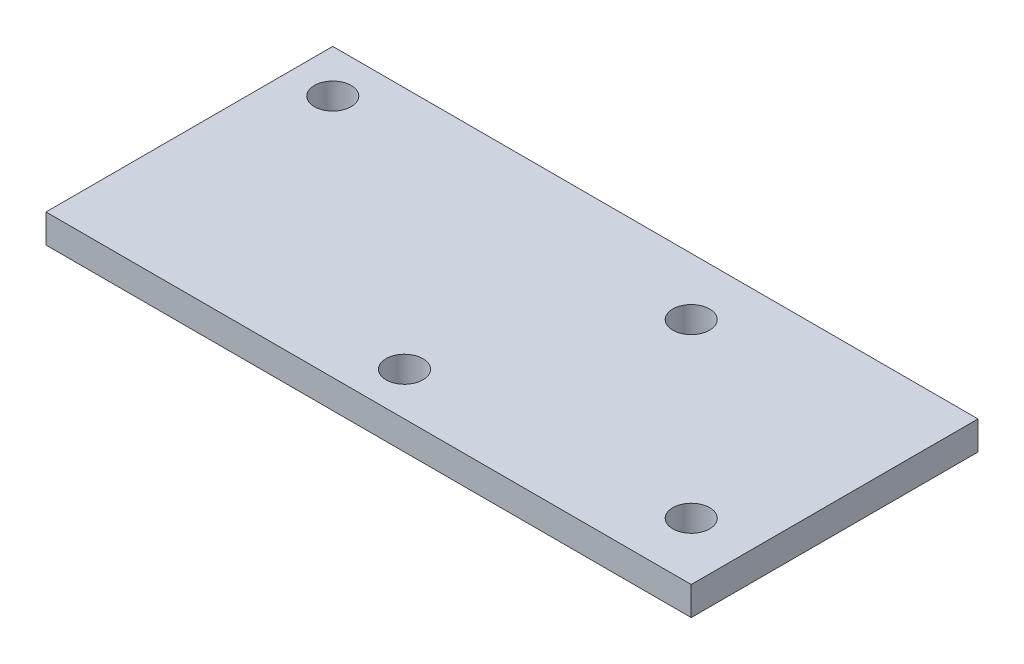
ISO-10303-21;
HEADER;
FILE_DESCRIPTION(('STEP AP214'),'2;1');
FILE_NAME('part.step','',(''),(''),'','','');
FILE_SCHEMA(('AUTOMOTIVE_DESIGN { 1 0 10303 214 1 1 1 1 }'));
ENDSEC;
DATA;
#1=APPLICATION_CONTEXT('core data for automotive mechanical design processes');
#2=APPLICATION_PROTOCOL_DEFINITION('international standard','automotive_design',2000,#1);
#3=PRODUCT_CONTEXT('',#1,'mechanical');
#4=PRODUCT('Part','Part','',(#3));
#5=PRODUCT_RELATED_PRODUCT_CATEGORY('part','',(#4));
#6=PRODUCT_DEFINITION_FORMATION('','',#4);
#7=PRODUCT_DEFINITION_CONTEXT('part definition',#1,'design');
#8=PRODUCT_DEFINITION('design','',#6,#7);
#9=PRODUCT_DEFINITION_SHAPE('','',#8);
#10=(LENGTH_UNIT() NAMED_UNIT(*) SI_UNIT(.MILLI.,.METRE.));
#11=(NAMED_UNIT(*) PLANE_ANGLE_UNIT() SI_UNIT($,.RADIAN.));
#12=(NAMED_UNIT(*) SI_UNIT($,.STERADIAN.) SOLID_ANGLE_UNIT());
#13=UNCERTAINTY_MEASURE_WITH_UNIT(LENGTH_MEASURE(1.E-05),#10,'distance_accuracy_value','');
#14=(GEOMETRIC_REPRESENTATION_CONTEXT(3) GLOBAL_UNCERTAINTY_ASSIGNED_CONTEXT((#13)) GLOBAL_UNIT_ASSIGNED_CONTEXT((#10,
#11,#12)) REPRESENTATION_CONTEXT('',''));
#15=CARTESIAN_POINT('',(0.,0.,0.));
#16=DIRECTION('',(0.,0.,1.));
#17=DIRECTION('',(1.,0.,0.));
#18=AXIS2_PLACEMENT_3D('',#15,#16,#17);
#19=CARTESIAN_POINT('',(28.575,2.54,-12.7));
#20=DIRECTION('',(-1.,0.,0.));
#21=DIRECTION('',(0.,0.,1.));
#22=AXIS2_PLACEMENT_3D('',#19,#20,#21);
#23=PLANE('',#22);
#24=DIRECTION('',(0.,0.,-1.));
#25=VECTOR('',#24,1.);
#26=CARTESIAN_POINT('',(28.575,0.,-12.7));
#27=LINE('',#26,#25);
#28=CARTESIAN_POINT('',(28.575,0.,12.7));
#29=VERTEX_POINT('',#28);
#30=CARTESIAN_POINT('',(28.575,0.,-12.7));
#31=VERTEX_POINT('',#30);
#32=EDGE_CURVE('E95',#29,#31,#27,.T.);
#33=ORIENTED_EDGE('',*,*,#32,.T.);
#34=DIRECTION('',(0.,-1.,0.));
#35=VECTOR('',#34,1.);
#36=CARTESIAN_POINT('',(28.575,2.54,-12.7));
#37=LINE('',#36,#35);
#38=CARTESIAN_POINT('',(28.575,2.54,-12.7));
#39=VERTEX_POINT('',#38);
#40=EDGE_CURVE('E11',#39,#31,#37,.T.);
#41=ORIENTED_EDGE('',*,*,#40,.F.);
#42=DIRECTION('',(0.,0.,-1.));
#43=VECTOR('',#42,1.);
#44=CARTESIAN_POINT('',(28.575,2.54,-12.7));
#45=LINE('',#44,#43);
#46=CARTESIAN_POINT('',(28.575,2.54,12.7));
#47=VERTEX_POINT('',#46);
#48=EDGE_CURVE('E83',#47,#39,#45,.T.);
#49=ORIENTED_EDGE('',*,*,#48,.F.);
#50=DIRECTION('',(0.,-1.,0.));
#51=VECTOR('',#50,1.);
#52=CARTESIAN_POINT('',(28.575,2.54,12.7));
#53=LINE('',#52,#51);
#54=EDGE_CURVE('E91',#47,#29,#53,.T.);
#55=ORIENTED_EDGE('',*,*,#54,.T.);
#56=EDGE_LOOP('',(#33,#41,#49,#55));
#57=FACE_BOUND('',#56,.T.);
#58=ADVANCED_FACE('F32',(#57),#23,.F.);
#59=CARTESIAN_POINT('',(-28.575,2.54,-12.7));
#60=DIRECTION('',(0.,0.,1.));
#61=DIRECTION('',(1.,0.,0.));
#62=AXIS2_PLACEMENT_3D('',#59,#60,#61);
#63=PLANE('',#62);
#64=DIRECTION('',(-1.,0.,0.));
#65=VECTOR('',#64,1.);
#66=CARTESIAN_POINT('',(-28.575,0.,-12.7));
#67=LINE('',#66,#65);
#68=CARTESIAN_POINT('',(-28.575,0.,-12.7));
#69=VERTEX_POINT('',#68);
#70=EDGE_CURVE('E87',#31,#69,#67,.T.);
#71=ORIENTED_EDGE('',*,*,#70,.T.);
#72=DIRECTION('',(0.,-1.,0.));
#73=VECTOR('',#72,1.);
#74=CARTESIAN_POINT('',(-28.575,2.54,-12.7));
#75=LINE('',#74,#73);
#76=CARTESIAN_POINT('',(-28.575,2.54,-12.7));
#77=VERTEX_POINT('',#76);
#78=EDGE_CURVE('E40',#77,#69,#75,.T.);
#79=ORIENTED_EDGE('',*,*,#78,.F.);
#80=DIRECTION('',(-1.,0.,0.));
#81=VECTOR('',#80,1.);
#82=CARTESIAN_POINT('',(-28.575,2.54,-12.7));
#83=LINE('',#82,#81);
#84=EDGE_CURVE('E78',#39,#77,#83,.T.);
#85=ORIENTED_EDGE('',*,*,#84,.F.);
#86=ORIENTED_EDGE('',*,*,#40,.T.);
#87=EDGE_LOOP('',(#71,#79,#85,#86));
#88=FACE_BOUND('',#87,.T.);
#89=ADVANCED_FACE('F86',(#88),#63,.F.);
#90=CARTESIAN_POINT('',(-28.575,2.54,-12.7));
#91=DIRECTION('',(1.,0.,0.));
#92=DIRECTION('',(0.,0.,-1.));
#93=AXIS2_PLACEMENT_3D('',#90,#91,#92);
#94=PLANE('',#93);
#95=DIRECTION('',(0.,0.,1.));
#96=VECTOR('',#95,1.);
#97=CARTESIAN_POINT('',(-28.575,0.,-12.7));
#98=LINE('',#97,#96);
#99=CARTESIAN_POINT('',(-28.575,0.,12.7));
#100=VERTEX_POINT('',#99);
#101=EDGE_CURVE('E65',#69,#100,#98,.T.);
#102=ORIENTED_EDGE('',*,*,#101,.T.);
#103=DIRECTION('',(0.,-1.,0.));
#104=VECTOR('',#103,1.);
#105=CARTESIAN_POINT('',(-28.575,2.54,12.7));
#106=LINE('',#105,#104);
#107=CARTESIAN_POINT('',(-28.575,2.54,12.7));
#108=VERTEX_POINT('',#107);
#109=EDGE_CURVE('E88',#108,#100,#106,.T.);
#110=ORIENTED_EDGE('',*,*,#109,.F.);
#111=DIRECTION('',(0.,0.,1.));
#112=VECTOR('',#111,1.);
#113=CARTESIAN_POINT('',(-28.575,2.54,-12.7));
#114=LINE('',#113,#112);
#115=EDGE_CURVE('E81',#77,#108,#114,.T.);
#116=ORIENTED_EDGE('',*,*,#115,.F.);
#117=ORIENTED_EDGE('',*,*,#78,.T.);
#118=EDGE_LOOP('',(#102,#110,#116,#117));
#119=FACE_BOUND('',#118,.T.);
#120=ADVANCED_FACE('F89',(#119),#94,.F.);
#121=CARTESIAN_POINT('',(-28.575,2.54,12.7));
#122=DIRECTION('',(0.,0.,-1.));
#123=DIRECTION('',(-1.,0.,0.));
#124=AXIS2_PLACEMENT_3D('',#121,#122,#123);
#125=PLANE('',#124);
#126=DIRECTION('',(1.,0.,0.));
#127=VECTOR('',#126,1.);
#128=CARTESIAN_POINT('',(-28.575,0.,12.7));
#129=LINE('',#128,#127);
#130=EDGE_CURVE('E71',#100,#29,#129,.T.);
#131=ORIENTED_EDGE('',*,*,#130,.T.);
#132=ORIENTED_EDGE('',*,*,#54,.F.);
#133=DIRECTION('',(1.,0.,0.));
#134=VECTOR('',#133,1.);
#135=CARTESIAN_POINT('',(-28.575,2.54,12.7));
#136=LINE('',#135,#134);
#137=EDGE_CURVE('E48',#108,#47,#136,.T.);
#138=ORIENTED_EDGE('',*,*,#137,.F.);
#139=ORIENTED_EDGE('',*,*,#109,.T.);
#140=EDGE_LOOP('',(#131,#132,#138,#139));
#141=FACE_BOUND('',#140,.T.);
#142=ADVANCED_FACE('F103',(#141),#125,.F.);
#143=CARTESIAN_POINT('',(0.,2.54,0.));
#144=DIRECTION('',(0.,1.,0.));
#145=DIRECTION('',(0.,0.,1.));
#146=AXIS2_PLACEMENT_3D('',#143,#144,#145);
#147=PLANE('',#146);
#148=CARTESIAN_POINT('',(-24.765,2.54,-8.88999999999999));
#149=DIRECTION('',(0.,1.,0.));
#150=DIRECTION('',(0.,0.,1.));
#151=AXIS2_PLACEMENT_3D('',#148,#149,#150);
#152=CIRCLE('',#151,1.63195);
#153=CARTESIAN_POINT('',(-24.765,2.54,-7.25804999999999));
#154=VERTEX_POINT('',#153);
#155=EDGE_CURVE('E129',#154,#154,#152,.T.);
#156=ORIENTED_EDGE('',*,*,#155,.F.);
#157=EDGE_LOOP('',(#156));
#158=FACE_BOUND('',#157,.T.);
#159=CARTESIAN_POINT('',(-0.634999999999986,2.54,8.89000000000001));
#160=DIRECTION('',(0.,1.,0.));
#161=DIRECTION('',(0.,0.,1.));
#162=AXIS2_PLACEMENT_3D('',#159,#160,#161);
#163=CIRCLE('',#162,1.63195);
#164=CARTESIAN_POINT('',(-0.634999999999986,2.54,10.52195));
#165=VERTEX_POINT('',#164);
#166=EDGE_CURVE('E123',#165,#165,#163,.T.);
#167=ORIENTED_EDGE('',*,*,#166,.F.);
#168=EDGE_LOOP('',(#167));
#169=FACE_BOUND('',#168,.T.);
#170=CARTESIAN_POINT('',(8.25500000000001,2.54,-7.61999999999999));
#171=DIRECTION('',(0.,1.,0.));
#172=DIRECTION('',(0.,0.,1.));
#173=AXIS2_PLACEMENT_3D('',#170,#171,#172);
#174=CIRCLE('',#173,1.63195);
#175=CARTESIAN_POINT('',(8.25500000000001,2.54,-5.98804999999999));
#176=VERTEX_POINT('',#175);
#177=EDGE_CURVE('E117',#176,#176,#174,.T.);
#178=ORIENTED_EDGE('',*,*,#177,.F.);
#179=EDGE_LOOP('',(#178));
#180=FACE_BOUND('',#179,.T.);
#181=CARTESIAN_POINT('',(23.495,2.54,7.62000000000001));
#182=DIRECTION('',(0.,1.,0.));
#183=DIRECTION('',(0.,0.,1.));
#184=AXIS2_PLACEMENT_3D('',#181,#182,#183);
#185=CIRCLE('',#184,1.63195);
#186=CARTESIAN_POINT('',(23.495,2.54,9.25195000000001));
#187=VERTEX_POINT('',#186);
#188=EDGE_CURVE('E111',#187,#187,#185,.T.);
#189=ORIENTED_EDGE('',*,*,#188,.F.);
#190=EDGE_LOOP('',(#189));
#191=FACE_BOUND('',#190,.T.);
#192=ORIENTED_EDGE('',*,*,#48,.T.);
#193=ORIENTED_EDGE('',*,*,#84,.T.);
#194=ORIENTED_EDGE('',*,*,#115,.T.);
#195=ORIENTED_EDGE('',*,*,#137,.T.);
#196=EDGE_LOOP('',(#192,#193,#194,#195));
#197=FACE_BOUND('',#196,.T.);
#198=ADVANCED_FACE('F79',(#158,#169,#180,#191,#197),#147,.T.);
#199=CARTESIAN_POINT('',(0.,0.,0.));
#200=DIRECTION('',(0.,1.,0.));
#201=DIRECTION('',(0.,0.,1.));
#202=AXIS2_PLACEMENT_3D('',#199,#200,#201);
#203=PLANE('',#202);
#204=CARTESIAN_POINT('',(-24.765,0.,-8.88999999999999));
#205=DIRECTION('',(0.,1.,0.));
#206=DIRECTION('',(0.,0.,1.));
#207=AXIS2_PLACEMENT_3D('',#204,#205,#206);
#208=CIRCLE('',#207,1.63195);
#209=CARTESIAN_POINT('',(-24.765,0.,-7.25804999999999));
#210=VERTEX_POINT('',#209);
#211=EDGE_CURVE('E126',#210,#210,#208,.T.);
#212=ORIENTED_EDGE('',*,*,#211,.T.);
#213=EDGE_LOOP('',(#212));
#214=FACE_BOUND('',#213,.T.);
#215=CARTESIAN_POINT('',(-0.634999999999986,0.,8.89000000000001));
#216=DIRECTION('',(0.,1.,0.));
#217=DIRECTION('',(0.,0.,1.));
#218=AXIS2_PLACEMENT_3D('',#215,#216,#217);
#219=CIRCLE('',#218,1.63195);
#220=CARTESIAN_POINT('',(-0.634999999999986,0.,10.52195));
#221=VERTEX_POINT('',#220);
#222=EDGE_CURVE('E120',#221,#221,#219,.T.);
#223=ORIENTED_EDGE('',*,*,#222,.T.);
#224=EDGE_LOOP('',(#223));
#225=FACE_BOUND('',#224,.T.);
#226=CARTESIAN_POINT('',(8.25500000000001,0.,-7.61999999999999));
#227=DIRECTION('',(0.,1.,0.));
#228=DIRECTION('',(0.,0.,1.));
#229=AXIS2_PLACEMENT_3D('',#226,#227,#228);
#230=CIRCLE('',#229,1.63195);
#231=CARTESIAN_POINT('',(8.25500000000001,0.,-5.98804999999999));
#232=VERTEX_POINT('',#231);
#233=EDGE_CURVE('E114',#232,#232,#230,.T.);
#234=ORIENTED_EDGE('',*,*,#233,.T.);
#235=EDGE_LOOP('',(#234));
#236=FACE_BOUND('',#235,.T.);
#237=CARTESIAN_POINT('',(23.495,0.,7.62000000000001));
#238=DIRECTION('',(0.,1.,0.));
#239=DIRECTION('',(0.,0.,1.));
#240=AXIS2_PLACEMENT_3D('',#237,#238,#239);
#241=CIRCLE('',#240,1.63195);
#242=CARTESIAN_POINT('',(23.495,0.,9.25195000000001));
#243=VERTEX_POINT('',#242);
#244=EDGE_CURVE('E98',#243,#243,#241,.T.);
#245=ORIENTED_EDGE('',*,*,#244,.T.);
#246=EDGE_LOOP('',(#245));
#247=FACE_BOUND('',#246,.T.);
#248=ORIENTED_EDGE('',*,*,#32,.F.);
#249=ORIENTED_EDGE('',*,*,#130,.F.);
#250=ORIENTED_EDGE('',*,*,#101,.F.);
#251=ORIENTED_EDGE('',*,*,#70,.F.);
#252=EDGE_LOOP('',(#248,#249,#250,#251));
#253=FACE_BOUND('',#252,.T.);
#254=ADVANCED_FACE('F106',(#214,#225,#236,#247,#253),#203,.F.);
#255=CARTESIAN_POINT('',(23.495,2.54,7.62000000000001));
#256=DIRECTION('',(0.,1.,0.));
#257=DIRECTION('',(0.,0.,1.));
#258=AXIS2_PLACEMENT_3D('',#255,#256,#257);
#259=CYLINDRICAL_SURFACE('',#258,1.63195);
#260=ORIENTED_EDGE('',*,*,#244,.F.);
#261=EDGE_LOOP('',(#260));
#262=FACE_BOUND('',#261,.T.);
#263=ORIENTED_EDGE('',*,*,#188,.T.);
#264=EDGE_LOOP('',(#263));
#265=FACE_BOUND('',#264,.T.);
#266=ADVANCED_FACE('F144',(#262,#265),#259,.F.);
#267=CARTESIAN_POINT('',(8.25500000000001,2.54,-7.61999999999999));
#268=DIRECTION('',(0.,1.,0.));
#269=DIRECTION('',(0.,0.,1.));
#270=AXIS2_PLACEMENT_3D('',#267,#268,#269);
#271=CYLINDRICAL_SURFACE('',#270,1.63195);
#272=ORIENTED_EDGE('',*,*,#233,.F.);
#273=EDGE_LOOP('',(#272));
#274=FACE_BOUND('',#273,.T.);
#275=ORIENTED_EDGE('',*,*,#177,.T.);
#276=EDGE_LOOP('',(#275));
#277=FACE_BOUND('',#276,.T.);
#278=ADVANCED_FACE('F146',(#274,#277),#271,.F.);
#279=CARTESIAN_POINT('',(-0.634999999999986,2.54,8.89000000000001));
#280=DIRECTION('',(0.,1.,0.));
#281=DIRECTION('',(0.,0.,1.));
#282=AXIS2_PLACEMENT_3D('',#279,#280,#281);
#283=CYLINDRICAL_SURFACE('',#282,1.63195);
#284=ORIENTED_EDGE('',*,*,#222,.F.);
#285=EDGE_LOOP('',(#284));
#286=FACE_BOUND('',#285,.T.);
#287=ORIENTED_EDGE('',*,*,#166,.T.);
#288=EDGE_LOOP('',(#287));
#289=FACE_BOUND('',#288,.T.);
#290=ADVANCED_FACE('F153',(#286,#289),#283,.F.);
#291=CARTESIAN_POINT('',(-24.765,2.54,-8.88999999999999));
#292=DIRECTION('',(0.,1.,0.));
#293=DIRECTION('',(0.,0.,1.));
#294=AXIS2_PLACEMENT_3D('',#291,#292,#293);
#295=CYLINDRICAL_SURFACE('',#294,1.63195);
#296=ORIENTED_EDGE('',*,*,#211,.F.);
#297=EDGE_LOOP('',(#296));
#298=FACE_BOUND('',#297,.T.);
#299=ORIENTED_EDGE('',*,*,#155,.T.);
#300=EDGE_LOOP('',(#299));
#301=FACE_BOUND('',#300,.T.);
#302=ADVANCED_FACE('F133',(#298,#301),#295,.F.);
#303=CLOSED_SHELL('',(#58,#89,#120,#142,#198,#254,#266,#278,#290,#302));
#304=MANIFOLD_SOLID_BREP('B2',#303);
#305=ADVANCED_BREP_SHAPE_REPRESENTATION('',(#18,#304),#14);
#306=SHAPE_DEFINITION_REPRESENTATION(#9,#305);
ENDSEC;
END-ISO-10303-21;
